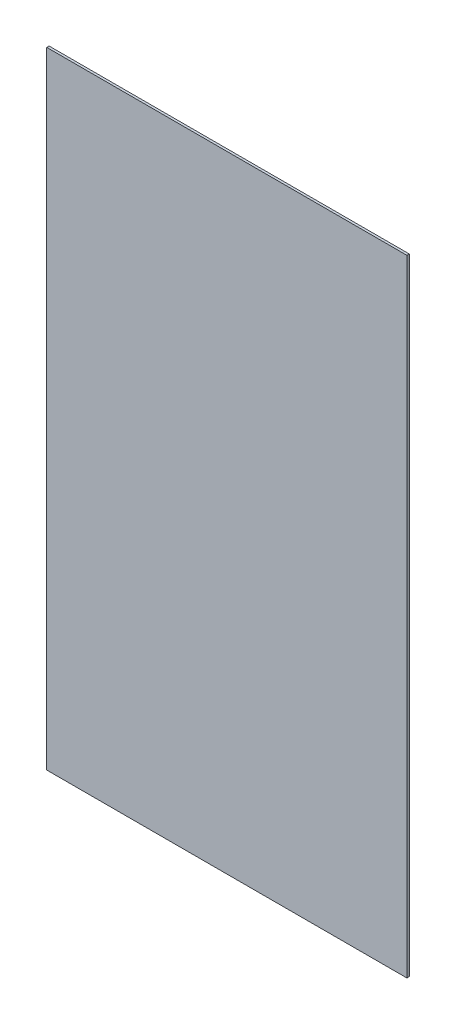
ISO-10303-21;
HEADER;
FILE_DESCRIPTION(('STEP AP214'),'2;1');
FILE_NAME('part.step','',(''),(''),'','','');
FILE_SCHEMA(('AUTOMOTIVE_DESIGN { 1 0 10303 214 1 1 1 1 }'));
ENDSEC;
DATA;
#1=APPLICATION_CONTEXT('core data for automotive mechanical design processes');
#2=APPLICATION_PROTOCOL_DEFINITION('international standard','automotive_design',2000,#1);
#3=PRODUCT_CONTEXT('',#1,'mechanical');
#4=PRODUCT('Part','Part','',(#3));
#5=PRODUCT_RELATED_PRODUCT_CATEGORY('part','',(#4));
#6=PRODUCT_DEFINITION_FORMATION('','',#4);
#7=PRODUCT_DEFINITION_CONTEXT('part definition',#1,'design');
#8=PRODUCT_DEFINITION('design','',#6,#7);
#9=PRODUCT_DEFINITION_SHAPE('','',#8);
#10=(LENGTH_UNIT() NAMED_UNIT(*) SI_UNIT(.MILLI.,.METRE.));
#11=(NAMED_UNIT(*) PLANE_ANGLE_UNIT() SI_UNIT($,.RADIAN.));
#12=(NAMED_UNIT(*) SI_UNIT($,.STERADIAN.) SOLID_ANGLE_UNIT());
#13=UNCERTAINTY_MEASURE_WITH_UNIT(LENGTH_MEASURE(1.E-05),#10,'distance_accuracy_value','');
#14=(GEOMETRIC_REPRESENTATION_CONTEXT(3) GLOBAL_UNCERTAINTY_ASSIGNED_CONTEXT((#13)) GLOBAL_UNIT_ASSIGNED_CONTEXT((#10,
#11,#12)) REPRESENTATION_CONTEXT('',''));
#15=CARTESIAN_POINT('',(0.,0.,0.));
#16=DIRECTION('',(0.,0.,1.));
#17=DIRECTION('',(1.,0.,0.));
#18=AXIS2_PLACEMENT_3D('',#15,#16,#17);
#19=CARTESIAN_POINT('',(-187.901785714286,191.986607142857,2.));
#20=DIRECTION('',(1.,0.,0.));
#21=DIRECTION('',(0.,1.,0.));
#22=AXIS2_PLACEMENT_3D('',#19,#20,#21);
#23=PLANE('',#22);
#24=DIRECTION('',(0.,-1.,0.));
#25=VECTOR('',#24,1.);
#26=CARTESIAN_POINT('',(-187.901785714286,191.986607142857,0.));
#27=LINE('',#26,#25);
#28=CARTESIAN_POINT('',(-187.901785714286,191.986607142857,0.));
#29=VERTEX_POINT('',#28);
#30=CARTESIAN_POINT('',(-187.901785714286,-338.013392857143,0.));
#31=VERTEX_POINT('',#30);
#32=EDGE_CURVE('E95',#29,#31,#27,.T.);
#33=ORIENTED_EDGE('',*,*,#32,.T.);
#34=DIRECTION('',(0.,0.,-1.));
#35=VECTOR('',#34,1.);
#36=CARTESIAN_POINT('',(-187.901785714286,-338.013392857143,2.));
#37=LINE('',#36,#35);
#38=CARTESIAN_POINT('',(-187.901785714286,-338.013392857143,2.));
#39=VERTEX_POINT('',#38);
#40=EDGE_CURVE('E11',#39,#31,#37,.T.);
#41=ORIENTED_EDGE('',*,*,#40,.F.);
#42=DIRECTION('',(0.,-1.,0.));
#43=VECTOR('',#42,1.);
#44=CARTESIAN_POINT('',(-187.901785714286,191.986607142857,2.));
#45=LINE('',#44,#43);
#46=CARTESIAN_POINT('',(-187.901785714286,191.986607142857,2.));
#47=VERTEX_POINT('',#46);
#48=EDGE_CURVE('E83',#47,#39,#45,.T.);
#49=ORIENTED_EDGE('',*,*,#48,.F.);
#50=DIRECTION('',(0.,0.,-1.));
#51=VECTOR('',#50,1.);
#52=CARTESIAN_POINT('',(-187.901785714286,191.986607142857,2.));
#53=LINE('',#52,#51);
#54=EDGE_CURVE('E91',#47,#29,#53,.T.);
#55=ORIENTED_EDGE('',*,*,#54,.T.);
#56=EDGE_LOOP('',(#33,#41,#49,#55));
#57=FACE_BOUND('',#56,.T.);
#58=ADVANCED_FACE('F32',(#57),#23,.F.);
#59=CARTESIAN_POINT('',(-187.901785714286,-338.013392857143,2.));
#60=DIRECTION('',(0.,1.,0.));
#61=DIRECTION('',(0.,0.,1.));
#62=AXIS2_PLACEMENT_3D('',#59,#60,#61);
#63=PLANE('',#62);
#64=DIRECTION('',(1.,0.,0.));
#65=VECTOR('',#64,1.);
#66=CARTESIAN_POINT('',(-187.901785714286,-338.013392857143,0.));
#67=LINE('',#66,#65);
#68=CARTESIAN_POINT('',(117.098214285714,-338.013392857143,0.));
#69=VERTEX_POINT('',#68);
#70=EDGE_CURVE('E87',#31,#69,#67,.T.);
#71=ORIENTED_EDGE('',*,*,#70,.T.);
#72=DIRECTION('',(0.,0.,-1.));
#73=VECTOR('',#72,1.);
#74=CARTESIAN_POINT('',(117.098214285714,-338.013392857143,2.));
#75=LINE('',#74,#73);
#76=CARTESIAN_POINT('',(117.098214285714,-338.013392857143,2.));
#77=VERTEX_POINT('',#76);
#78=EDGE_CURVE('E40',#77,#69,#75,.T.);
#79=ORIENTED_EDGE('',*,*,#78,.F.);
#80=DIRECTION('',(1.,0.,0.));
#81=VECTOR('',#80,1.);
#82=CARTESIAN_POINT('',(-187.901785714286,-338.013392857143,2.));
#83=LINE('',#82,#81);
#84=EDGE_CURVE('E78',#39,#77,#83,.T.);
#85=ORIENTED_EDGE('',*,*,#84,.F.);
#86=ORIENTED_EDGE('',*,*,#40,.T.);
#87=EDGE_LOOP('',(#71,#79,#85,#86));
#88=FACE_BOUND('',#87,.T.);
#89=ADVANCED_FACE('F86',(#88),#63,.F.);
#90=CARTESIAN_POINT('',(117.098214285714,191.986607142857,2.));
#91=DIRECTION('',(-1.,0.,0.));
#92=DIRECTION('',(0.,-1.,0.));
#93=AXIS2_PLACEMENT_3D('',#90,#91,#92);
#94=PLANE('',#93);
#95=DIRECTION('',(0.,1.,0.));
#96=VECTOR('',#95,1.);
#97=CARTESIAN_POINT('',(117.098214285714,191.986607142857,0.));
#98=LINE('',#97,#96);
#99=CARTESIAN_POINT('',(117.098214285714,191.986607142857,0.));
#100=VERTEX_POINT('',#99);
#101=EDGE_CURVE('E65',#69,#100,#98,.T.);
#102=ORIENTED_EDGE('',*,*,#101,.T.);
#103=DIRECTION('',(0.,0.,-1.));
#104=VECTOR('',#103,1.);
#105=CARTESIAN_POINT('',(117.098214285714,191.986607142857,2.));
#106=LINE('',#105,#104);
#107=CARTESIAN_POINT('',(117.098214285714,191.986607142857,2.));
#108=VERTEX_POINT('',#107);
#109=EDGE_CURVE('E88',#108,#100,#106,.T.);
#110=ORIENTED_EDGE('',*,*,#109,.F.);
#111=DIRECTION('',(0.,1.,0.));
#112=VECTOR('',#111,1.);
#113=CARTESIAN_POINT('',(117.098214285714,191.986607142857,2.));
#114=LINE('',#113,#112);
#115=EDGE_CURVE('E81',#77,#108,#114,.T.);
#116=ORIENTED_EDGE('',*,*,#115,.F.);
#117=ORIENTED_EDGE('',*,*,#78,.T.);
#118=EDGE_LOOP('',(#102,#110,#116,#117));
#119=FACE_BOUND('',#118,.T.);
#120=ADVANCED_FACE('F89',(#119),#94,.F.);
#121=CARTESIAN_POINT('',(-187.901785714286,191.986607142857,2.));
#122=DIRECTION('',(0.,-1.,0.));
#123=DIRECTION('',(0.,0.,-1.));
#124=AXIS2_PLACEMENT_3D('',#121,#122,#123);
#125=PLANE('',#124);
#126=DIRECTION('',(-1.,0.,0.));
#127=VECTOR('',#126,1.);
#128=CARTESIAN_POINT('',(-187.901785714286,191.986607142857,0.));
#129=LINE('',#128,#127);
#130=EDGE_CURVE('E71',#100,#29,#129,.T.);
#131=ORIENTED_EDGE('',*,*,#130,.T.);
#132=ORIENTED_EDGE('',*,*,#54,.F.);
#133=DIRECTION('',(-1.,0.,0.));
#134=VECTOR('',#133,1.);
#135=CARTESIAN_POINT('',(-187.901785714286,191.986607142857,2.));
#136=LINE('',#135,#134);
#137=EDGE_CURVE('E48',#108,#47,#136,.T.);
#138=ORIENTED_EDGE('',*,*,#137,.F.);
#139=ORIENTED_EDGE('',*,*,#109,.T.);
#140=EDGE_LOOP('',(#131,#132,#138,#139));
#141=FACE_BOUND('',#140,.T.);
#142=ADVANCED_FACE('F102',(#141),#125,.F.);
#143=CARTESIAN_POINT('',(0.,0.,2.));
#144=DIRECTION('',(0.,0.,1.));
#145=DIRECTION('',(1.,0.,0.));
#146=AXIS2_PLACEMENT_3D('',#143,#144,#145);
#147=PLANE('',#146);
#148=ORIENTED_EDGE('',*,*,#48,.T.);
#149=ORIENTED_EDGE('',*,*,#84,.T.);
#150=ORIENTED_EDGE('',*,*,#115,.T.);
#151=ORIENTED_EDGE('',*,*,#137,.T.);
#152=EDGE_LOOP('',(#148,#149,#150,#151));
#153=FACE_BOUND('',#152,.T.);
#154=ADVANCED_FACE('F79',(#153),#147,.T.);
#155=CARTESIAN_POINT('',(0.,0.,0.));
#156=DIRECTION('',(0.,0.,1.));
#157=DIRECTION('',(1.,0.,0.));
#158=AXIS2_PLACEMENT_3D('',#155,#156,#157);
#159=PLANE('',#158);
#160=ORIENTED_EDGE('',*,*,#32,.F.);
#161=ORIENTED_EDGE('',*,*,#130,.F.);
#162=ORIENTED_EDGE('',*,*,#101,.F.);
#163=ORIENTED_EDGE('',*,*,#70,.F.);
#164=EDGE_LOOP('',(#160,#161,#162,#163));
#165=FACE_BOUND('',#164,.T.);
#166=ADVANCED_FACE('F105',(#165),#159,.F.);
#167=CLOSED_SHELL('',(#58,#89,#120,#142,#154,#166));
#168=MANIFOLD_SOLID_BREP('B2',#167);
#169=ADVANCED_BREP_SHAPE_REPRESENTATION('',(#18,#168),#14);
#170=SHAPE_DEFINITION_REPRESENTATION(#9,#169);
ENDSEC;
END-ISO-10303-21;
